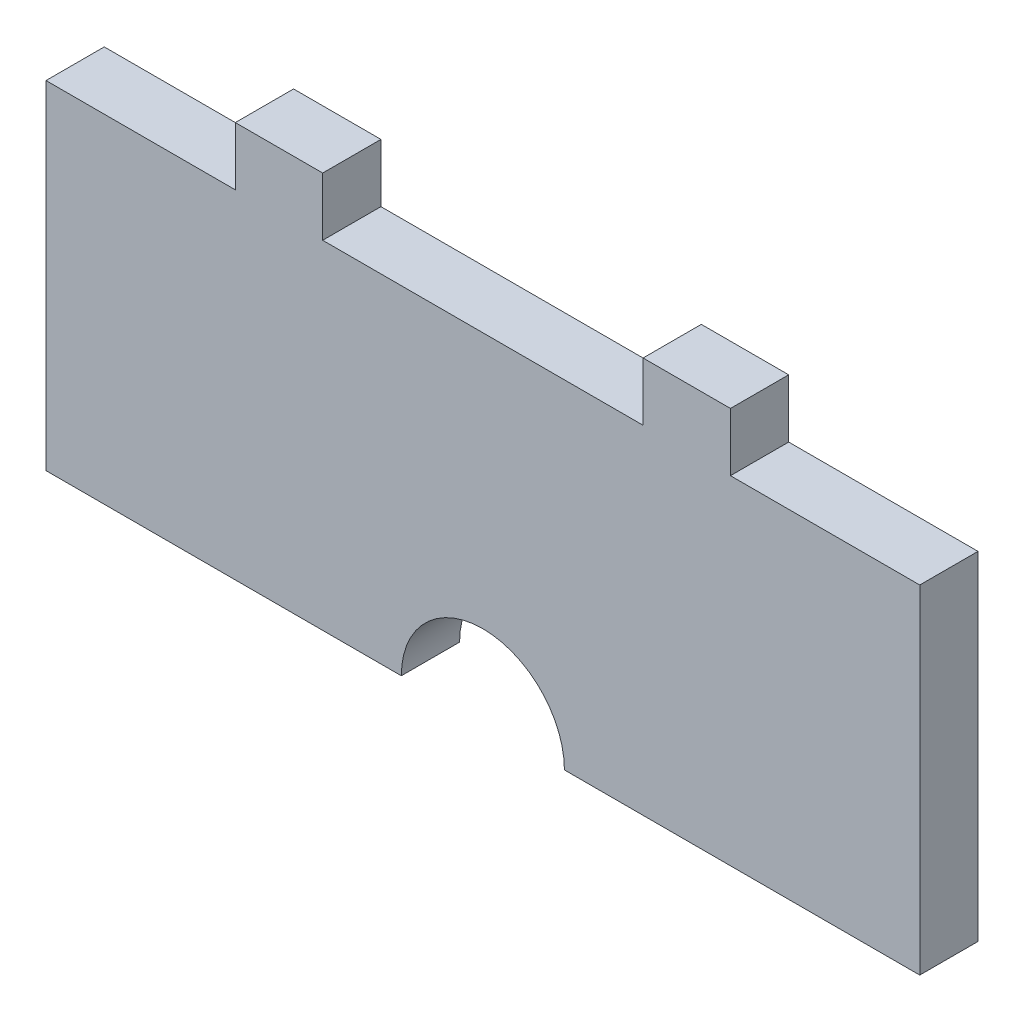
ISO-10303-21;
HEADER;
FILE_DESCRIPTION(('STEP AP214'),'2;1');
FILE_NAME('part.step','',(''),(''),'','','');
FILE_SCHEMA(('AUTOMOTIVE_DESIGN { 1 0 10303 214 1 1 1 1 }'));
ENDSEC;
DATA;
#1=APPLICATION_CONTEXT('core data for automotive mechanical design processes');
#2=APPLICATION_PROTOCOL_DEFINITION('international standard','automotive_design',2000,#1);
#3=PRODUCT_CONTEXT('',#1,'mechanical');
#4=PRODUCT('Part','Part','',(#3));
#5=PRODUCT_RELATED_PRODUCT_CATEGORY('part','',(#4));
#6=PRODUCT_DEFINITION_FORMATION('','',#4);
#7=PRODUCT_DEFINITION_CONTEXT('part definition',#1,'design');
#8=PRODUCT_DEFINITION('design','',#6,#7);
#9=PRODUCT_DEFINITION_SHAPE('','',#8);
#10=(LENGTH_UNIT() NAMED_UNIT(*) SI_UNIT(.MILLI.,.METRE.));
#11=(NAMED_UNIT(*) PLANE_ANGLE_UNIT() SI_UNIT($,.RADIAN.));
#12=(NAMED_UNIT(*) SI_UNIT($,.STERADIAN.) SOLID_ANGLE_UNIT());
#13=UNCERTAINTY_MEASURE_WITH_UNIT(LENGTH_MEASURE(1.E-05),#10,'distance_accuracy_value','');
#14=(GEOMETRIC_REPRESENTATION_CONTEXT(3) GLOBAL_UNCERTAINTY_ASSIGNED_CONTEXT((#13)) GLOBAL_UNIT_ASSIGNED_CONTEXT((#10,
#11,#12)) REPRESENTATION_CONTEXT('',''));
#15=CARTESIAN_POINT('',(0.,0.,0.));
#16=DIRECTION('',(0.,0.,1.));
#17=DIRECTION('',(1.,0.,0.));
#18=AXIS2_PLACEMENT_3D('',#15,#16,#17);
#19=CARTESIAN_POINT('',(-76.2000000000001,142.24,-12.7));
#20=DIRECTION('',(0.,-1.,0.));
#21=DIRECTION('',(0.,0.,-1.));
#22=AXIS2_PLACEMENT_3D('',#19,#20,#21);
#23=PLANE('',#22);
#24=DIRECTION('',(0.,0.,1.));
#25=VECTOR('',#24,1.);
#26=CARTESIAN_POINT('',(36.8299999999999,142.24,-12.7));
#27=LINE('',#26,#25);
#28=CARTESIAN_POINT('',(36.8299999999999,142.24,-12.7));
#29=VERTEX_POINT('',#28);
#30=CARTESIAN_POINT('',(36.8299999999999,142.24,0.));
#31=VERTEX_POINT('',#30);
#32=EDGE_CURVE('E61',#29,#31,#27,.T.);
#33=ORIENTED_EDGE('',*,*,#32,.F.);
#34=DIRECTION('',(1.,0.,0.));
#35=VECTOR('',#34,1.);
#36=CARTESIAN_POINT('',(-76.2000000000001,142.24,-12.7));
#37=LINE('',#36,#35);
#38=CARTESIAN_POINT('',(114.3,142.24,-12.7));
#39=VERTEX_POINT('',#38);
#40=EDGE_CURVE('E404',#29,#39,#37,.T.);
#41=ORIENTED_EDGE('',*,*,#40,.T.);
#42=DIRECTION('',(0.,0.,1.));
#43=VECTOR('',#42,1.);
#44=CARTESIAN_POINT('',(114.3,142.24,-12.7));
#45=LINE('',#44,#43);
#46=CARTESIAN_POINT('',(114.3,142.24,0.));
#47=VERTEX_POINT('',#46);
#48=EDGE_CURVE('E227',#39,#47,#45,.T.);
#49=ORIENTED_EDGE('',*,*,#48,.T.);
#50=DIRECTION('',(1.,0.,0.));
#51=VECTOR('',#50,1.);
#52=CARTESIAN_POINT('',(-76.2000000000001,142.24,0.));
#53=LINE('',#52,#51);
#54=EDGE_CURVE('E182',#31,#47,#53,.T.);
#55=ORIENTED_EDGE('',*,*,#54,.F.);
#56=EDGE_LOOP('',(#33,#41,#49,#55));
#57=FACE_BOUND('',#56,.T.);
#58=ADVANCED_FACE('F44',(#57),#23,.T.);
#59=CARTESIAN_POINT('',(-76.2000000000001,215.9,-12.7));
#60=DIRECTION('',(-1.,0.,0.));
#61=DIRECTION('',(0.,-1.,0.));
#62=AXIS2_PLACEMENT_3D('',#59,#60,#61);
#63=PLANE('',#62);
#64=DIRECTION('',(0.,-1.,0.));
#65=VECTOR('',#64,1.);
#66=CARTESIAN_POINT('',(-76.2000000000001,215.9,0.));
#67=LINE('',#66,#65);
#68=CARTESIAN_POINT('',(-76.2000000000001,215.9,0.));
#69=VERTEX_POINT('',#68);
#70=CARTESIAN_POINT('',(-76.2000000000001,142.24,0.));
#71=VERTEX_POINT('',#70);
#72=EDGE_CURVE('E179',#69,#71,#67,.T.);
#73=ORIENTED_EDGE('',*,*,#72,.F.);
#74=DIRECTION('',(0.,0.,1.));
#75=VECTOR('',#74,1.);
#76=CARTESIAN_POINT('',(-76.2000000000001,215.9,-12.7));
#77=LINE('',#76,#75);
#78=CARTESIAN_POINT('',(-76.2000000000001,215.9,-12.7));
#79=VERTEX_POINT('',#78);
#80=EDGE_CURVE('E13',#79,#69,#77,.T.);
#81=ORIENTED_EDGE('',*,*,#80,.F.);
#82=DIRECTION('',(0.,-1.,0.));
#83=VECTOR('',#82,1.);
#84=CARTESIAN_POINT('',(-76.2000000000001,215.9,-12.7));
#85=LINE('',#84,#83);
#86=CARTESIAN_POINT('',(-76.2000000000001,142.24,-12.7));
#87=VERTEX_POINT('',#86);
#88=EDGE_CURVE('E212',#79,#87,#85,.T.);
#89=ORIENTED_EDGE('',*,*,#88,.T.);
#90=DIRECTION('',(0.,0.,1.));
#91=VECTOR('',#90,1.);
#92=CARTESIAN_POINT('',(-76.2000000000001,142.24,-12.7));
#93=LINE('',#92,#91);
#94=EDGE_CURVE('E48',#87,#71,#93,.T.);
#95=ORIENTED_EDGE('',*,*,#94,.T.);
#96=EDGE_LOOP('',(#73,#81,#89,#95));
#97=FACE_BOUND('',#96,.T.);
#98=ADVANCED_FACE('F46',(#97),#63,.T.);
#99=CARTESIAN_POINT('',(-76.2000000000001,215.9,-12.7));
#100=DIRECTION('',(0.,1.,0.));
#101=DIRECTION('',(0.,0.,1.));
#102=AXIS2_PLACEMENT_3D('',#99,#100,#101);
#103=PLANE('',#102);
#104=DIRECTION('',(-1.,0.,0.));
#105=VECTOR('',#104,1.);
#106=CARTESIAN_POINT('',(-76.2000000000001,215.9,0.));
#107=LINE('',#106,#105);
#108=CARTESIAN_POINT('',(-34.9250000000001,215.9,0.));
#109=VERTEX_POINT('',#108);
#110=EDGE_CURVE('E210',#109,#69,#107,.T.);
#111=ORIENTED_EDGE('',*,*,#110,.F.);
#112=DIRECTION('',(0.,0.,1.));
#113=VECTOR('',#112,1.);
#114=CARTESIAN_POINT('',(-34.9250000000001,215.9,-12.7));
#115=LINE('',#114,#113);
#116=CARTESIAN_POINT('',(-34.9250000000001,215.9,-12.7));
#117=VERTEX_POINT('',#116);
#118=EDGE_CURVE('E53',#117,#109,#115,.T.);
#119=ORIENTED_EDGE('',*,*,#118,.F.);
#120=DIRECTION('',(-1.,0.,0.));
#121=VECTOR('',#120,1.);
#122=CARTESIAN_POINT('',(-76.2000000000001,215.9,-12.7));
#123=LINE('',#122,#121);
#124=EDGE_CURVE('E169',#117,#79,#123,.T.);
#125=ORIENTED_EDGE('',*,*,#124,.T.);
#126=ORIENTED_EDGE('',*,*,#80,.T.);
#127=EDGE_LOOP('',(#111,#119,#125,#126));
#128=FACE_BOUND('',#127,.T.);
#129=ADVANCED_FACE('F239',(#128),#103,.T.);
#130=CARTESIAN_POINT('',(-34.9250000000001,215.9,-12.7));
#131=DIRECTION('',(-1.,0.,0.));
#132=DIRECTION('',(0.,0.,1.));
#133=AXIS2_PLACEMENT_3D('',#130,#131,#132);
#134=PLANE('',#133);
#135=DIRECTION('',(0.,-1.,0.));
#136=VECTOR('',#135,1.);
#137=CARTESIAN_POINT('',(-34.9250000000001,215.9,0.));
#138=LINE('',#137,#136);
#139=CARTESIAN_POINT('',(-34.9250000000001,228.6,0.));
#140=VERTEX_POINT('',#139);
#141=EDGE_CURVE('E155',#140,#109,#138,.T.);
#142=ORIENTED_EDGE('',*,*,#141,.F.);
#143=DIRECTION('',(0.,0.,1.));
#144=VECTOR('',#143,1.);
#145=CARTESIAN_POINT('',(-34.9250000000001,228.6,-12.7));
#146=LINE('',#145,#144);
#147=CARTESIAN_POINT('',(-34.9250000000001,228.6,-12.7));
#148=VERTEX_POINT('',#147);
#149=EDGE_CURVE('E149',#148,#140,#146,.T.);
#150=ORIENTED_EDGE('',*,*,#149,.F.);
#151=DIRECTION('',(0.,-1.,0.));
#152=VECTOR('',#151,1.);
#153=CARTESIAN_POINT('',(-34.9250000000001,215.9,-12.7));
#154=LINE('',#153,#152);
#155=EDGE_CURVE('E152',#148,#117,#154,.T.);
#156=ORIENTED_EDGE('',*,*,#155,.T.);
#157=ORIENTED_EDGE('',*,*,#118,.T.);
#158=EDGE_LOOP('',(#142,#150,#156,#157));
#159=FACE_BOUND('',#158,.T.);
#160=ADVANCED_FACE('F151',(#159),#134,.T.);
#161=CARTESIAN_POINT('',(-15.8750000000001,228.6,-12.7));
#162=DIRECTION('',(0.,1.,0.));
#163=DIRECTION('',(0.,0.,1.));
#164=AXIS2_PLACEMENT_3D('',#161,#162,#163);
#165=PLANE('',#164);
#166=DIRECTION('',(-1.,0.,0.));
#167=VECTOR('',#166,1.);
#168=CARTESIAN_POINT('',(-15.8750000000001,228.6,0.));
#169=LINE('',#168,#167);
#170=CARTESIAN_POINT('',(-15.8750000000001,228.6,0.));
#171=VERTEX_POINT('',#170);
#172=EDGE_CURVE('E207',#171,#140,#169,.T.);
#173=ORIENTED_EDGE('',*,*,#172,.F.);
#174=DIRECTION('',(0.,0.,1.));
#175=VECTOR('',#174,1.);
#176=CARTESIAN_POINT('',(-15.8750000000001,228.6,-12.7));
#177=LINE('',#176,#175);
#178=CARTESIAN_POINT('',(-15.8750000000001,228.6,-12.7));
#179=VERTEX_POINT('',#178);
#180=EDGE_CURVE('E160',#179,#171,#177,.T.);
#181=ORIENTED_EDGE('',*,*,#180,.F.);
#182=DIRECTION('',(-1.,0.,0.));
#183=VECTOR('',#182,1.);
#184=CARTESIAN_POINT('',(-15.8750000000001,228.6,-12.7));
#185=LINE('',#184,#183);
#186=EDGE_CURVE('E167',#179,#148,#185,.T.);
#187=ORIENTED_EDGE('',*,*,#186,.T.);
#188=ORIENTED_EDGE('',*,*,#149,.T.);
#189=EDGE_LOOP('',(#173,#181,#187,#188));
#190=FACE_BOUND('',#189,.T.);
#191=ADVANCED_FACE('F171',(#190),#165,.T.);
#192=CARTESIAN_POINT('',(-15.8750000000001,215.9,-12.7));
#193=DIRECTION('',(1.,0.,0.));
#194=DIRECTION('',(0.,0.,-1.));
#195=AXIS2_PLACEMENT_3D('',#192,#193,#194);
#196=PLANE('',#195);
#197=DIRECTION('',(0.,1.,0.));
#198=VECTOR('',#197,1.);
#199=CARTESIAN_POINT('',(-15.8750000000001,215.9,0.));
#200=LINE('',#199,#198);
#201=CARTESIAN_POINT('',(-15.8750000000001,215.9,0.));
#202=VERTEX_POINT('',#201);
#203=EDGE_CURVE('E204',#202,#171,#200,.T.);
#204=ORIENTED_EDGE('',*,*,#203,.F.);
#205=DIRECTION('',(0.,0.,1.));
#206=VECTOR('',#205,1.);
#207=CARTESIAN_POINT('',(-15.8750000000001,215.9,-12.7));
#208=LINE('',#207,#206);
#209=CARTESIAN_POINT('',(-15.8750000000001,215.9,-12.7));
#210=VERTEX_POINT('',#209);
#211=EDGE_CURVE('E216',#210,#202,#208,.T.);
#212=ORIENTED_EDGE('',*,*,#211,.F.);
#213=DIRECTION('',(0.,1.,0.));
#214=VECTOR('',#213,1.);
#215=CARTESIAN_POINT('',(-15.8750000000001,215.9,-12.7));
#216=LINE('',#215,#214);
#217=EDGE_CURVE('E172',#210,#179,#216,.T.);
#218=ORIENTED_EDGE('',*,*,#217,.T.);
#219=ORIENTED_EDGE('',*,*,#180,.T.);
#220=EDGE_LOOP('',(#204,#212,#218,#219));
#221=FACE_BOUND('',#220,.T.);
#222=ADVANCED_FACE('F282',(#221),#196,.T.);
#223=CARTESIAN_POINT('',(-15.8750000000001,215.9,-12.7));
#224=DIRECTION('',(0.,1.,0.));
#225=DIRECTION('',(0.,0.,1.));
#226=AXIS2_PLACEMENT_3D('',#223,#224,#225);
#227=PLANE('',#226);
#228=DIRECTION('',(-1.,0.,0.));
#229=VECTOR('',#228,1.);
#230=CARTESIAN_POINT('',(-15.8750000000001,215.9,0.));
#231=LINE('',#230,#229);
#232=CARTESIAN_POINT('',(53.9749999999999,215.9,0.));
#233=VERTEX_POINT('',#232);
#234=EDGE_CURVE('E201',#233,#202,#231,.T.);
#235=ORIENTED_EDGE('',*,*,#234,.F.);
#236=DIRECTION('',(0.,0.,1.));
#237=VECTOR('',#236,1.);
#238=CARTESIAN_POINT('',(53.9749999999999,215.9,-12.7));
#239=LINE('',#238,#237);
#240=CARTESIAN_POINT('',(53.9749999999999,215.9,-12.7));
#241=VERTEX_POINT('',#240);
#242=EDGE_CURVE('E218',#241,#233,#239,.T.);
#243=ORIENTED_EDGE('',*,*,#242,.F.);
#244=DIRECTION('',(-1.,0.,0.));
#245=VECTOR('',#244,1.);
#246=CARTESIAN_POINT('',(-15.8750000000001,215.9,-12.7));
#247=LINE('',#246,#245);
#248=EDGE_CURVE('E174',#241,#210,#247,.T.);
#249=ORIENTED_EDGE('',*,*,#248,.T.);
#250=ORIENTED_EDGE('',*,*,#211,.T.);
#251=EDGE_LOOP('',(#235,#243,#249,#250));
#252=FACE_BOUND('',#251,.T.);
#253=ADVANCED_FACE('F278',(#252),#227,.T.);
#254=CARTESIAN_POINT('',(53.9749999999999,215.9,-12.7));
#255=DIRECTION('',(-1.,0.,0.));
#256=DIRECTION('',(0.,0.,1.));
#257=AXIS2_PLACEMENT_3D('',#254,#255,#256);
#258=PLANE('',#257);
#259=DIRECTION('',(0.,-1.,0.));
#260=VECTOR('',#259,1.);
#261=CARTESIAN_POINT('',(53.9749999999999,215.9,0.));
#262=LINE('',#261,#260);
#263=CARTESIAN_POINT('',(53.9749999999999,228.6,0.));
#264=VERTEX_POINT('',#263);
#265=EDGE_CURVE('E198',#264,#233,#262,.T.);
#266=ORIENTED_EDGE('',*,*,#265,.F.);
#267=DIRECTION('',(0.,0.,1.));
#268=VECTOR('',#267,1.);
#269=CARTESIAN_POINT('',(53.9749999999999,228.6,-12.7));
#270=LINE('',#269,#268);
#271=CARTESIAN_POINT('',(53.9749999999999,228.6,-12.7));
#272=VERTEX_POINT('',#271);
#273=EDGE_CURVE('E220',#272,#264,#270,.T.);
#274=ORIENTED_EDGE('',*,*,#273,.F.);
#275=DIRECTION('',(0.,-1.,0.));
#276=VECTOR('',#275,1.);
#277=CARTESIAN_POINT('',(53.9749999999999,215.9,-12.7));
#278=LINE('',#277,#276);
#279=EDGE_CURVE('E387',#272,#241,#278,.T.);
#280=ORIENTED_EDGE('',*,*,#279,.T.);
#281=ORIENTED_EDGE('',*,*,#242,.T.);
#282=EDGE_LOOP('',(#266,#274,#280,#281));
#283=FACE_BOUND('',#282,.T.);
#284=ADVANCED_FACE('F274',(#283),#258,.T.);
#285=CARTESIAN_POINT('',(73.0249999999999,228.6,-12.7));
#286=DIRECTION('',(0.,1.,0.));
#287=DIRECTION('',(0.,0.,1.));
#288=AXIS2_PLACEMENT_3D('',#285,#286,#287);
#289=PLANE('',#288);
#290=DIRECTION('',(-1.,0.,0.));
#291=VECTOR('',#290,1.);
#292=CARTESIAN_POINT('',(73.0249999999999,228.6,0.));
#293=LINE('',#292,#291);
#294=CARTESIAN_POINT('',(73.0249999999999,228.6,0.));
#295=VERTEX_POINT('',#294);
#296=EDGE_CURVE('E195',#295,#264,#293,.T.);
#297=ORIENTED_EDGE('',*,*,#296,.F.);
#298=DIRECTION('',(0.,0.,1.));
#299=VECTOR('',#298,1.);
#300=CARTESIAN_POINT('',(73.0249999999999,228.6,-12.7));
#301=LINE('',#300,#299);
#302=CARTESIAN_POINT('',(73.0249999999999,228.6,-12.7));
#303=VERTEX_POINT('',#302);
#304=EDGE_CURVE('E222',#303,#295,#301,.T.);
#305=ORIENTED_EDGE('',*,*,#304,.F.);
#306=DIRECTION('',(-1.,0.,0.));
#307=VECTOR('',#306,1.);
#308=CARTESIAN_POINT('',(73.0249999999999,228.6,-12.7));
#309=LINE('',#308,#307);
#310=EDGE_CURVE('E388',#303,#272,#309,.T.);
#311=ORIENTED_EDGE('',*,*,#310,.T.);
#312=ORIENTED_EDGE('',*,*,#273,.T.);
#313=EDGE_LOOP('',(#297,#305,#311,#312));
#314=FACE_BOUND('',#313,.T.);
#315=ADVANCED_FACE('F270',(#314),#289,.T.);
#316=CARTESIAN_POINT('',(73.0249999999999,215.9,-12.7));
#317=DIRECTION('',(1.,0.,0.));
#318=DIRECTION('',(0.,0.,-1.));
#319=AXIS2_PLACEMENT_3D('',#316,#317,#318);
#320=PLANE('',#319);
#321=DIRECTION('',(0.,1.,0.));
#322=VECTOR('',#321,1.);
#323=CARTESIAN_POINT('',(73.0249999999999,215.9,0.));
#324=LINE('',#323,#322);
#325=CARTESIAN_POINT('',(73.0249999999999,215.9,0.));
#326=VERTEX_POINT('',#325);
#327=EDGE_CURVE('E192',#326,#295,#324,.T.);
#328=ORIENTED_EDGE('',*,*,#327,.F.);
#329=DIRECTION('',(0.,0.,1.));
#330=VECTOR('',#329,1.);
#331=CARTESIAN_POINT('',(73.0249999999999,215.9,-12.7));
#332=LINE('',#331,#330);
#333=CARTESIAN_POINT('',(73.0249999999999,215.9,-12.7));
#334=VERTEX_POINT('',#333);
#335=EDGE_CURVE('E224',#334,#326,#332,.T.);
#336=ORIENTED_EDGE('',*,*,#335,.F.);
#337=DIRECTION('',(0.,1.,0.));
#338=VECTOR('',#337,1.);
#339=CARTESIAN_POINT('',(73.0249999999999,215.9,-12.7));
#340=LINE('',#339,#338);
#341=EDGE_CURVE('E393',#334,#303,#340,.T.);
#342=ORIENTED_EDGE('',*,*,#341,.T.);
#343=ORIENTED_EDGE('',*,*,#304,.T.);
#344=EDGE_LOOP('',(#328,#336,#342,#343));
#345=FACE_BOUND('',#344,.T.);
#346=ADVANCED_FACE('F264',(#345),#320,.T.);
#347=CARTESIAN_POINT('',(73.0249999999999,215.9,-12.7));
#348=DIRECTION('',(0.,1.,0.));
#349=DIRECTION('',(0.,0.,1.));
#350=AXIS2_PLACEMENT_3D('',#347,#348,#349);
#351=PLANE('',#350);
#352=DIRECTION('',(-1.,0.,0.));
#353=VECTOR('',#352,1.);
#354=CARTESIAN_POINT('',(73.0249999999999,215.9,0.));
#355=LINE('',#354,#353);
#356=CARTESIAN_POINT('',(114.3,215.9,0.));
#357=VERTEX_POINT('',#356);
#358=EDGE_CURVE('E189',#357,#326,#355,.T.);
#359=ORIENTED_EDGE('',*,*,#358,.F.);
#360=DIRECTION('',(0.,0.,1.));
#361=VECTOR('',#360,1.);
#362=CARTESIAN_POINT('',(114.3,215.9,-12.7));
#363=LINE('',#362,#361);
#364=CARTESIAN_POINT('',(114.3,215.9,-12.7));
#365=VERTEX_POINT('',#364);
#366=EDGE_CURVE('E226',#365,#357,#363,.T.);
#367=ORIENTED_EDGE('',*,*,#366,.F.);
#368=DIRECTION('',(-1.,0.,0.));
#369=VECTOR('',#368,1.);
#370=CARTESIAN_POINT('',(73.0249999999999,215.9,-12.7));
#371=LINE('',#370,#369);
#372=EDGE_CURVE('E396',#365,#334,#371,.T.);
#373=ORIENTED_EDGE('',*,*,#372,.T.);
#374=ORIENTED_EDGE('',*,*,#335,.T.);
#375=EDGE_LOOP('',(#359,#367,#373,#374));
#376=FACE_BOUND('',#375,.T.);
#377=ADVANCED_FACE('F259',(#376),#351,.T.);
#378=CARTESIAN_POINT('',(114.3,215.9,-12.7));
#379=DIRECTION('',(1.,0.,0.));
#380=DIRECTION('',(0.,1.,0.));
#381=AXIS2_PLACEMENT_3D('',#378,#379,#380);
#382=PLANE('',#381);
#383=DIRECTION('',(0.,1.,0.));
#384=VECTOR('',#383,1.);
#385=CARTESIAN_POINT('',(114.3,215.9,0.));
#386=LINE('',#385,#384);
#387=EDGE_CURVE('E186',#47,#357,#386,.T.);
#388=ORIENTED_EDGE('',*,*,#387,.F.);
#389=ORIENTED_EDGE('',*,*,#48,.F.);
#390=DIRECTION('',(0.,1.,0.));
#391=VECTOR('',#390,1.);
#392=CARTESIAN_POINT('',(114.3,215.9,-12.7));
#393=LINE('',#392,#391);
#394=EDGE_CURVE('E399',#39,#365,#393,.T.);
#395=ORIENTED_EDGE('',*,*,#394,.T.);
#396=ORIENTED_EDGE('',*,*,#366,.T.);
#397=EDGE_LOOP('',(#388,#389,#395,#396));
#398=FACE_BOUND('',#397,.T.);
#399=ADVANCED_FACE('F253',(#398),#382,.T.);
#400=DIRECTION('',(0.,0.,1.));
#401=VECTOR('',#400,1.);
#402=CARTESIAN_POINT('',(1.26999999999994,142.24,-12.7));
#403=LINE('',#402,#401);
#404=CARTESIAN_POINT('',(1.26999999999994,142.24,0.));
#405=VERTEX_POINT('',#404);
#406=CARTESIAN_POINT('',(1.26999999999994,142.24,-12.7));
#407=VERTEX_POINT('',#406);
#408=EDGE_CURVE('E236',#405,#407,#403,.F.);
#409=ORIENTED_EDGE('',*,*,#408,.F.);
#410=EDGE_CURVE('E183',#71,#405,#53,.T.);
#411=ORIENTED_EDGE('',*,*,#410,.F.);
#412=ORIENTED_EDGE('',*,*,#94,.F.);
#413=EDGE_CURVE('E402',#87,#407,#37,.T.);
#414=ORIENTED_EDGE('',*,*,#413,.T.);
#415=EDGE_LOOP('',(#409,#411,#412,#414));
#416=FACE_BOUND('',#415,.T.);
#417=ADVANCED_FACE('F234',(#416),#23,.T.);
#418=CARTESIAN_POINT('',(-76.2000000000001,142.24,-12.7));
#419=DIRECTION('',(0.,0.,1.));
#420=DIRECTION('',(1.,0.,0.));
#421=AXIS2_PLACEMENT_3D('',#418,#419,#420);
#422=PLANE('',#421);
#423=ORIENTED_EDGE('',*,*,#40,.F.);
#424=CARTESIAN_POINT('',(19.0499999999999,142.24,-12.7));
#425=DIRECTION('',(0.,0.,1.));
#426=DIRECTION('',(1.,0.,0.));
#427=AXIS2_PLACEMENT_3D('',#424,#425,#426);
#428=CIRCLE('',#427,17.78);
#429=EDGE_CURVE('E408',#29,#407,#428,.T.);
#430=ORIENTED_EDGE('',*,*,#429,.T.);
#431=ORIENTED_EDGE('',*,*,#413,.F.);
#432=ORIENTED_EDGE('',*,*,#88,.F.);
#433=ORIENTED_EDGE('',*,*,#124,.F.);
#434=ORIENTED_EDGE('',*,*,#155,.F.);
#435=ORIENTED_EDGE('',*,*,#186,.F.);
#436=ORIENTED_EDGE('',*,*,#217,.F.);
#437=ORIENTED_EDGE('',*,*,#248,.F.);
#438=ORIENTED_EDGE('',*,*,#279,.F.);
#439=ORIENTED_EDGE('',*,*,#310,.F.);
#440=ORIENTED_EDGE('',*,*,#341,.F.);
#441=ORIENTED_EDGE('',*,*,#372,.F.);
#442=ORIENTED_EDGE('',*,*,#394,.F.);
#443=EDGE_LOOP('',(#423,#430,#431,#432,#433,#434,#435,#436,#437,#438,#439,#440,#441,#442));
#444=FACE_BOUND('',#443,.T.);
#445=ADVANCED_FACE('F165',(#444),#422,.F.);
#446=CARTESIAN_POINT('',(-76.2000000000001,142.24,0.));
#447=DIRECTION('',(0.,0.,1.));
#448=DIRECTION('',(1.,0.,0.));
#449=AXIS2_PLACEMENT_3D('',#446,#447,#448);
#450=PLANE('',#449);
#451=CARTESIAN_POINT('',(19.0499999999999,142.24,0.));
#452=DIRECTION('',(0.,0.,1.));
#453=DIRECTION('',(1.,0.,0.));
#454=AXIS2_PLACEMENT_3D('',#451,#452,#453);
#455=CIRCLE('',#454,17.78);
#456=EDGE_CURVE('E409',#31,#405,#455,.T.);
#457=ORIENTED_EDGE('',*,*,#456,.F.);
#458=ORIENTED_EDGE('',*,*,#54,.T.);
#459=ORIENTED_EDGE('',*,*,#387,.T.);
#460=ORIENTED_EDGE('',*,*,#358,.T.);
#461=ORIENTED_EDGE('',*,*,#327,.T.);
#462=ORIENTED_EDGE('',*,*,#296,.T.);
#463=ORIENTED_EDGE('',*,*,#265,.T.);
#464=ORIENTED_EDGE('',*,*,#234,.T.);
#465=ORIENTED_EDGE('',*,*,#203,.T.);
#466=ORIENTED_EDGE('',*,*,#172,.T.);
#467=ORIENTED_EDGE('',*,*,#141,.T.);
#468=ORIENTED_EDGE('',*,*,#110,.T.);
#469=ORIENTED_EDGE('',*,*,#72,.T.);
#470=ORIENTED_EDGE('',*,*,#410,.T.);
#471=EDGE_LOOP('',(#457,#458,#459,#460,#461,#462,#463,#464,#465,#466,#467,#468,#469,#470));
#472=FACE_BOUND('',#471,.T.);
#473=ADVANCED_FACE('F238',(#472),#450,.T.);
#474=CARTESIAN_POINT('',(19.0499999999999,142.24,-12.7));
#475=DIRECTION('',(0.,0.,1.));
#476=DIRECTION('',(1.,0.,0.));
#477=AXIS2_PLACEMENT_3D('',#474,#475,#476);
#478=CYLINDRICAL_SURFACE('',#477,17.78);
#479=ORIENTED_EDGE('',*,*,#32,.T.);
#480=ORIENTED_EDGE('',*,*,#456,.T.);
#481=ORIENTED_EDGE('',*,*,#408,.T.);
#482=ORIENTED_EDGE('',*,*,#429,.F.);
#483=EDGE_LOOP('',(#479,#480,#481,#482));
#484=FACE_BOUND('',#483,.T.);
#485=ADVANCED_FACE('F344',(#484),#478,.F.);
#486=CLOSED_SHELL('',(#58,#98,#129,#160,#191,#222,#253,#284,#315,#346,#377,#399,#417,#445,#473,#485));
#487=MANIFOLD_SOLID_BREP('B2',#486);
#488=ADVANCED_BREP_SHAPE_REPRESENTATION('',(#18,#487),#14);
#489=SHAPE_DEFINITION_REPRESENTATION(#9,#488);
ENDSEC;
END-ISO-10303-21;
